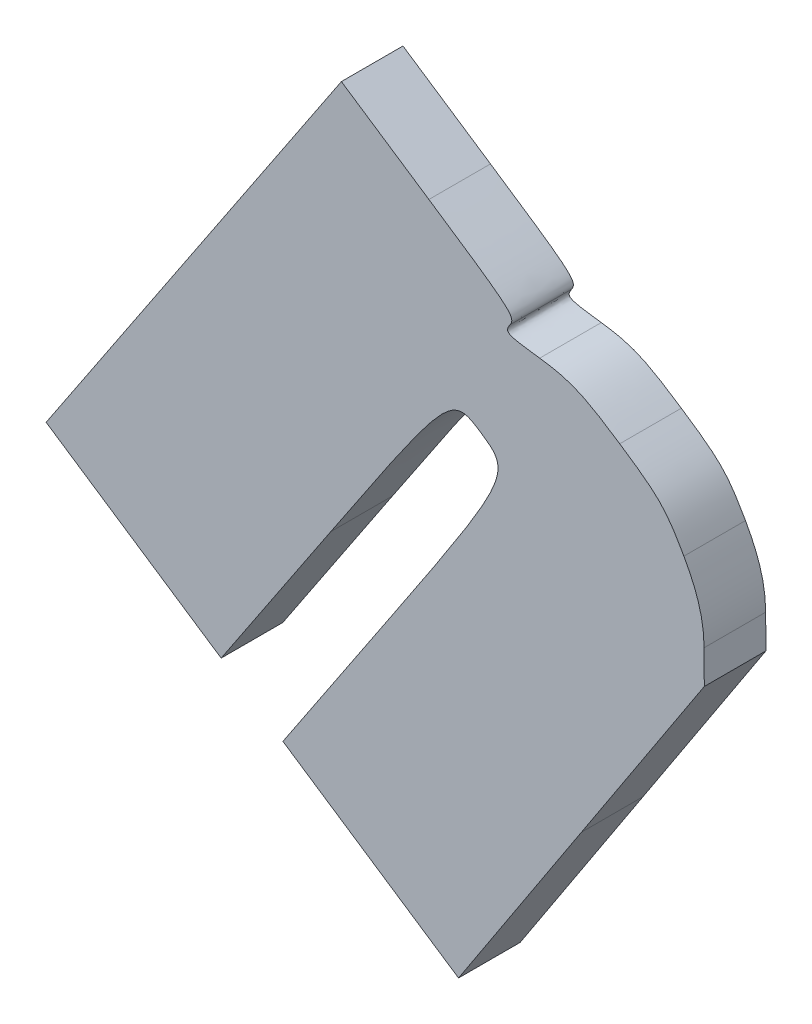
ISO-10303-21;
HEADER;
FILE_DESCRIPTION(('STEP AP214'),'2;1');
FILE_NAME('part.step','',(''),(''),'','','');
FILE_SCHEMA(('AUTOMOTIVE_DESIGN { 1 0 10303 214 1 1 1 1 }'));
ENDSEC;
DATA;
#1=APPLICATION_CONTEXT('core data for automotive mechanical design processes');
#2=APPLICATION_PROTOCOL_DEFINITION('international standard','automotive_design',2000,#1);
#3=PRODUCT_CONTEXT('',#1,'mechanical');
#4=PRODUCT('Part','Part','',(#3));
#5=PRODUCT_RELATED_PRODUCT_CATEGORY('part','',(#4));
#6=PRODUCT_DEFINITION_FORMATION('','',#4);
#7=PRODUCT_DEFINITION_CONTEXT('part definition',#1,'design');
#8=PRODUCT_DEFINITION('design','',#6,#7);
#9=PRODUCT_DEFINITION_SHAPE('','',#8);
#10=(LENGTH_UNIT() NAMED_UNIT(*) SI_UNIT(.MILLI.,.METRE.));
#11=(NAMED_UNIT(*) PLANE_ANGLE_UNIT() SI_UNIT($,.RADIAN.));
#12=(NAMED_UNIT(*) SI_UNIT($,.STERADIAN.) SOLID_ANGLE_UNIT());
#13=UNCERTAINTY_MEASURE_WITH_UNIT(LENGTH_MEASURE(1.E-05),#10,'distance_accuracy_value','');
#14=(GEOMETRIC_REPRESENTATION_CONTEXT(3) GLOBAL_UNCERTAINTY_ASSIGNED_CONTEXT((#13)) GLOBAL_UNIT_ASSIGNED_CONTEXT((#10,
#11,#12)) REPRESENTATION_CONTEXT('',''));
#15=CARTESIAN_POINT('',(0.,0.,0.));
#16=DIRECTION('',(0.,0.,1.));
#17=DIRECTION('',(1.,0.,0.));
#18=AXIS2_PLACEMENT_3D('',#15,#16,#17);
#19=CARTESIAN_POINT('',(-3.50758858771,-2.335805763627,0.));
#20=DIRECTION('',(0.836616693344232,-0.547788744332853,0.));
#21=DIRECTION('',(0.547788744332853,0.836616693344232,0.));
#22=AXIS2_PLACEMENT_3D('',#19,#20,#21);
#23=PLANE('',#22);
#24=DIRECTION('',(0.547788744332853,0.836616693344232,0.));
#25=VECTOR('',#24,1.);
#26=CARTESIAN_POINT('',(-3.50758858771,-2.335805763627,0.));
#27=LINE('',#26,#25);
#28=CARTESIAN_POINT('',(-3.50758858771,-2.335805763627,0.));
#29=VERTEX_POINT('',#28);
#30=CARTESIAN_POINT('',(-3.487638773381,-2.305337179032,0.));
#31=VERTEX_POINT('',#30);
#32=EDGE_CURVE('E11',#29,#31,#27,.T.);
#33=ORIENTED_EDGE('',*,*,#32,.T.);
#34=DIRECTION('',(0.,0.,1.));
#35=VECTOR('',#34,1.);
#36=CARTESIAN_POINT('',(-3.487638773381,-2.305337179032,0.));
#37=LINE('',#36,#35);
#38=CARTESIAN_POINT('',(-3.487638773381,-2.305337179032,0.01));
#39=VERTEX_POINT('',#38);
#40=EDGE_CURVE('E24',#31,#39,#37,.T.);
#41=ORIENTED_EDGE('',*,*,#40,.T.);
#42=DIRECTION('',(0.547788744332853,0.836616693344232,0.));
#43=VECTOR('',#42,1.);
#44=CARTESIAN_POINT('',(-3.50758858771,-2.335805763627,0.01));
#45=LINE('',#44,#43);
#46=CARTESIAN_POINT('',(-3.50758858771,-2.335805763627,0.01));
#47=VERTEX_POINT('',#46);
#48=EDGE_CURVE('E148',#47,#39,#45,.T.);
#49=ORIENTED_EDGE('',*,*,#48,.F.);
#50=DIRECTION('',(0.,0.,1.));
#51=VECTOR('',#50,1.);
#52=CARTESIAN_POINT('',(-3.50758858771,-2.335805763627,0.));
#53=LINE('',#52,#51);
#54=EDGE_CURVE('E336',#29,#47,#53,.T.);
#55=ORIENTED_EDGE('',*,*,#54,.F.);
#56=EDGE_LOOP('',(#33,#41,#49,#55));
#57=FACE_BOUND('',#56,.T.);
#58=ADVANCED_FACE('F17',(#57),#23,.T.);
#59=CARTESIAN_POINT('',(-3.536100829065,-2.316789946744,0.));
#60=DIRECTION('',(-0.554854841755568,-0.831947176556543,0.));
#61=DIRECTION('',(0.831947176556543,-0.554854841755568,0.));
#62=AXIS2_PLACEMENT_3D('',#59,#60,#61);
#63=PLANE('',#62);
#64=DIRECTION('',(0.831947176556543,-0.554854841755568,0.));
#65=VECTOR('',#64,1.);
#66=CARTESIAN_POINT('',(-3.536100829065,-2.316789946744,0.));
#67=LINE('',#66,#65);
#68=CARTESIAN_POINT('',(-3.536100829065,-2.316789946744,0.));
#69=VERTEX_POINT('',#68);
#70=EDGE_CURVE('E333',#69,#29,#67,.T.);
#71=ORIENTED_EDGE('',*,*,#70,.T.);
#72=ORIENTED_EDGE('',*,*,#54,.T.);
#73=DIRECTION('',(0.831947176556543,-0.554854841755568,0.));
#74=VECTOR('',#73,1.);
#75=CARTESIAN_POINT('',(-3.536100829065,-2.316789946744,0.01));
#76=LINE('',#75,#74);
#77=CARTESIAN_POINT('',(-3.536100829065,-2.316789946744,0.01));
#78=VERTEX_POINT('',#77);
#79=EDGE_CURVE('E331',#78,#47,#76,.T.);
#80=ORIENTED_EDGE('',*,*,#79,.F.);
#81=DIRECTION('',(0.,0.,1.));
#82=VECTOR('',#81,1.);
#83=CARTESIAN_POINT('',(-3.536100829065,-2.316789946744,0.));
#84=LINE('',#83,#82);
#85=EDGE_CURVE('E328',#69,#78,#84,.T.);
#86=ORIENTED_EDGE('',*,*,#85,.F.);
#87=EDGE_LOOP('',(#71,#72,#80,#86));
#88=FACE_BOUND('',#87,.T.);
#89=ADVANCED_FACE('F377',(#88),#63,.T.);
#90=CARTESIAN_POINT('',(-3.518666173916,-2.290648493099,0.));
#91=DIRECTION('',(-0.831947176556505,0.554854841755625,0.));
#92=DIRECTION('',(-0.554854841755625,-0.831947176556505,0.));
#93=AXIS2_PLACEMENT_3D('',#90,#91,#92);
#94=PLANE('',#93);
#95=DIRECTION('',(-0.554854841755625,-0.831947176556505,0.));
#96=VECTOR('',#95,1.);
#97=CARTESIAN_POINT('',(-3.518666173916,-2.290648493099,0.));
#98=LINE('',#97,#96);
#99=CARTESIAN_POINT('',(-3.518666173916,-2.290648493099,0.));
#100=VERTEX_POINT('',#99);
#101=EDGE_CURVE('E325',#100,#69,#98,.T.);
#102=ORIENTED_EDGE('',*,*,#101,.T.);
#103=ORIENTED_EDGE('',*,*,#85,.T.);
#104=DIRECTION('',(-0.554854841755625,-0.831947176556505,0.));
#105=VECTOR('',#104,1.);
#106=CARTESIAN_POINT('',(-3.518666173916,-2.290648493099,0.01));
#107=LINE('',#106,#105);
#108=CARTESIAN_POINT('',(-3.518666173916,-2.290648493099,0.01));
#109=VERTEX_POINT('',#108);
#110=EDGE_CURVE('E322',#109,#78,#107,.T.);
#111=ORIENTED_EDGE('',*,*,#110,.F.);
#112=DIRECTION('',(0.,0.,1.));
#113=VECTOR('',#112,1.);
#114=CARTESIAN_POINT('',(-3.518666173916,-2.290648493099,0.));
#115=LINE('',#114,#113);
#116=EDGE_CURVE('E316',#100,#109,#115,.T.);
#117=ORIENTED_EDGE('',*,*,#116,.F.);
#118=EDGE_LOOP('',(#102,#103,#111,#117));
#119=FACE_BOUND('',#118,.T.);
#120=ADVANCED_FACE('F374',(#119),#94,.T.);
#121=CARTESIAN_POINT('',(-3.503756256811,-2.25745560825,0.));
#122=CARTESIAN_POINT('',(-3.503756256811,-2.25745560825,0.01));
#123=CARTESIAN_POINT('',(-3.503335475025,-2.257736242427,0.));
#124=CARTESIAN_POINT('',(-3.503335475025,-2.257736242427,0.01));
#125=CARTESIAN_POINT('',(-3.502947198134,-2.258005439602,0.));
#126=CARTESIAN_POINT('',(-3.502947198134,-2.258005439602,0.01));
#127=CARTESIAN_POINT('',(-3.502240810753,-2.258578634989,0.));
#128=CARTESIAN_POINT('',(-3.502240810753,-2.258578634989,0.01));
#129=CARTESIAN_POINT('',(-3.501930140187,-2.258884315209,0.));
#130=CARTESIAN_POINT('',(-3.501930140187,-2.258884315209,0.01));
#131=CARTESIAN_POINT('',(-3.501487274858,-2.259524719963,0.));
#132=CARTESIAN_POINT('',(-3.501487274858,-2.259524719963,0.01));
#133=CARTESIAN_POINT('',(-3.501343450514,-2.25984187623,0.));
#134=CARTESIAN_POINT('',(-3.501343450514,-2.25984187623,0.01));
#135=CARTESIAN_POINT('',(-3.501168630304,-2.260602561726,0.));
#136=CARTESIAN_POINT('',(-3.501168630304,-2.260602561726,0.01));
#137=CARTESIAN_POINT('',(-3.501156723355,-2.261066779484,0.));
#138=CARTESIAN_POINT('',(-3.501156723355,-2.261066779484,0.01));
#139=CARTESIAN_POINT('',(-3.501373242916,-2.262471535714,0.));
#140=CARTESIAN_POINT('',(-3.501373242916,-2.262471535714,0.01));
#141=CARTESIAN_POINT('',(-3.501721930447,-2.26343181761,0.));
#142=CARTESIAN_POINT('',(-3.501721930447,-2.26343181761,0.01));
#143=CARTESIAN_POINT('',(-3.504093078297,-2.268710549124,0.));
#144=CARTESIAN_POINT('',(-3.504093078297,-2.268710549124,0.01));
#145=CARTESIAN_POINT('',(-3.50902412447,-2.276191241924,0.));
#146=CARTESIAN_POINT('',(-3.50902412447,-2.276191241924,0.01));
#147=CARTESIAN_POINT('',(-3.518666173916,-2.290648493099,0.));
#148=CARTESIAN_POINT('',(-3.518666173916,-2.290648493099,0.01));
#149=B_SPLINE_SURFACE_WITH_KNOTS('',3,1,((#121,#122),(#123,#124),(#125,#126),(#127,#128),(#129,
#130),(#131,#132),(#133,#134),(#135,#136),(#137,#138),(#139,#140),(#141,#142),(#143,#144),(#145,
#146),(#147,#148)),.UNSPECIFIED.,.F.,.F.,.F.,(4,2,2,2,2,2,4),(2,2),(0.,0.001431791294951,
0.002982479137338,0.004332679898994,0.005893946951502,0.008317110785515,0.018743675054939),(0.,
0.001),.UNSPECIFIED.);
#150=CARTESIAN_POINT('',(-3.503756256811,-2.25745560825,0.));
#151=CARTESIAN_POINT('',(-3.503335475025,-2.257736242427,0.));
#152=CARTESIAN_POINT('',(-3.502947198134,-2.258005439602,0.));
#153=CARTESIAN_POINT('',(-3.502240810753,-2.258578634989,0.));
#154=CARTESIAN_POINT('',(-3.501930140187,-2.258884315209,0.));
#155=CARTESIAN_POINT('',(-3.501487274858,-2.259524719963,0.));
#156=CARTESIAN_POINT('',(-3.501343450514,-2.25984187623,0.));
#157=CARTESIAN_POINT('',(-3.501168630304,-2.260602561726,0.));
#158=CARTESIAN_POINT('',(-3.501156723355,-2.261066779484,0.));
#159=CARTESIAN_POINT('',(-3.501373242916,-2.262471535714,0.));
#160=CARTESIAN_POINT('',(-3.501721930447,-2.26343181761,0.));
#161=CARTESIAN_POINT('',(-3.504093078297,-2.268710549124,0.));
#162=CARTESIAN_POINT('',(-3.50902412447,-2.276191241924,0.));
#163=CARTESIAN_POINT('',(-3.518666173916,-2.290648493099,0.));
#164=B_SPLINE_CURVE_WITH_KNOTS('',3,(#150,#151,#152,#153,#154,#155,#156,#157,#158,#159,#160,
#161,#162,#163),.UNSPECIFIED.,.F.,.F.,(4,2,2,2,2,2,4),(0.,0.001431791294951,0.002982479137338,
0.004332679898994,0.005893946951502,0.008317110785515,0.018743675054939),.UNSPECIFIED.);
#165=CARTESIAN_POINT('',(-3.503756256811,-2.25745560825,0.));
#166=VERTEX_POINT('',#165);
#167=EDGE_CURVE('E308',#166,#100,#164,.T.);
#168=CARTESIAN_POINT('',(-3.503756256811,-2.25745560825,0.01));
#169=CARTESIAN_POINT('',(-3.503335475025,-2.257736242427,0.01));
#170=CARTESIAN_POINT('',(-3.502947198134,-2.258005439602,0.01));
#171=CARTESIAN_POINT('',(-3.502240810753,-2.258578634989,0.01));
#172=CARTESIAN_POINT('',(-3.501930140187,-2.258884315209,0.01));
#173=CARTESIAN_POINT('',(-3.501487274858,-2.259524719963,0.01));
#174=CARTESIAN_POINT('',(-3.501343450514,-2.25984187623,0.01));
#175=CARTESIAN_POINT('',(-3.501168630304,-2.260602561726,0.01));
#176=CARTESIAN_POINT('',(-3.501156723355,-2.261066779484,0.01));
#177=CARTESIAN_POINT('',(-3.501373242916,-2.262471535714,0.01));
#178=CARTESIAN_POINT('',(-3.501721930447,-2.26343181761,0.01));
#179=CARTESIAN_POINT('',(-3.504093078297,-2.268710549124,0.01));
#180=CARTESIAN_POINT('',(-3.50902412447,-2.276191241924,0.01));
#181=CARTESIAN_POINT('',(-3.518666173916,-2.290648493099,0.01));
#182=B_SPLINE_CURVE_WITH_KNOTS('',3,(#168,#169,#170,#171,#172,#173,#174,#175,#176,#177,#178,
#179,#180,#181),.UNSPECIFIED.,.F.,.F.,(4,2,2,2,2,2,4),(0.,0.001431791294951,0.002982479137338,
0.004332679898994,0.005893946951502,0.008317110785515,0.018743675054939),.UNSPECIFIED.);
#183=CARTESIAN_POINT('',(-3.503756256811,-2.25745560825,0.01));
#184=VERTEX_POINT('',#183);
#185=EDGE_CURVE('E303',#184,#109,#182,.T.);
#186=DIRECTION('',(0.,0.,1.));
#187=VECTOR('',#186,1.);
#188=CARTESIAN_POINT('',(-3.503756256811,-2.25745560825,0.));
#189=LINE('',#188,#187);
#190=EDGE_CURVE('E297',#166,#184,#189,.T.);
#191=ORIENTED_EDGE('',*,*,#167,.T.);
#192=ORIENTED_EDGE('',*,*,#116,.T.);
#193=ORIENTED_EDGE('',*,*,#185,.F.);
#194=ORIENTED_EDGE('',*,*,#190,.F.);
#195=EDGE_LOOP('',(#191,#192,#193,#194));
#196=FACE_BOUND('',#195,.T.);
#197=ADVANCED_FACE('F371',(#196),#149,.T.);
#198=CARTESIAN_POINT('',(-3.528332748041,-2.283415302997,0.));
#199=CARTESIAN_POINT('',(-3.528332748041,-2.283415302997,0.01));
#200=CARTESIAN_POINT('',(-3.520835191726,-2.272173497007,0.));
#201=CARTESIAN_POINT('',(-3.520835191726,-2.272173497007,0.01));
#202=CARTESIAN_POINT('',(-3.516219568748,-2.265252891133,0.));
#203=CARTESIAN_POINT('',(-3.516219568748,-2.265252891133,0.01));
#204=CARTESIAN_POINT('',(-3.511610179836,-2.259243616746,0.));
#205=CARTESIAN_POINT('',(-3.511610179836,-2.259243616746,0.01));
#206=CARTESIAN_POINT('',(-3.510466287118,-2.257951945536,0.));
#207=CARTESIAN_POINT('',(-3.510466287118,-2.257951945536,0.01));
#208=CARTESIAN_POINT('',(-3.508993026628,-2.256702739628,0.));
#209=CARTESIAN_POINT('',(-3.508993026628,-2.256702739628,0.01));
#210=CARTESIAN_POINT('',(-3.508535412227,-2.256405267388,0.));
#211=CARTESIAN_POINT('',(-3.508535412227,-2.256405267388,0.01));
#212=CARTESIAN_POINT('',(-3.507756519619,-2.256067215621,0.));
#213=CARTESIAN_POINT('',(-3.507756519619,-2.256067215621,0.01));
#214=CARTESIAN_POINT('',(-3.507425973,-2.255990817727,0.));
#215=CARTESIAN_POINT('',(-3.507425973,-2.255990817727,0.01));
#216=CARTESIAN_POINT('',(-3.506733747328,-2.255961949918,0.));
#217=CARTESIAN_POINT('',(-3.506733747328,-2.255961949918,0.01));
#218=CARTESIAN_POINT('',(-3.506380235875,-2.2560307403,0.));
#219=CARTESIAN_POINT('',(-3.506380235875,-2.2560307403,0.01));
#220=CARTESIAN_POINT('',(-3.505338388617,-2.256400458887,0.));
#221=CARTESIAN_POINT('',(-3.505338388617,-2.256400458887,0.01));
#222=CARTESIAN_POINT('',(-3.504622239943,-2.256878053651,0.));
#223=CARTESIAN_POINT('',(-3.504622239943,-2.256878053651,0.01));
#224=CARTESIAN_POINT('',(-3.503756256811,-2.25745560825,0.));
#225=CARTESIAN_POINT('',(-3.503756256811,-2.25745560825,0.01));
#226=B_SPLINE_SURFACE_WITH_KNOTS('',3,1,((#198,#199),(#200,#201),(#202,#203),(#204,#205),(#206,
#207),(#208,#209),(#210,#211),(#212,#213),(#214,#215),(#216,#217),(#218,#219),(#220,#221),(#222,
#223),(#224,#225)),.UNSPECIFIED.,.F.,.F.,.F.,(4,2,2,2,2,2,4),(2,2),(0.,0.001327561020278,
0.001953185824936,0.002284201265773,0.002556855963974,0.002871255404629,0.003495802117152),(0.,
0.001),.UNSPECIFIED.);
#227=CARTESIAN_POINT('',(-3.528332748041,-2.283415302997,0.));
#228=CARTESIAN_POINT('',(-3.520835191726,-2.272173497007,0.));
#229=CARTESIAN_POINT('',(-3.516219568748,-2.265252891133,0.));
#230=CARTESIAN_POINT('',(-3.511610179836,-2.259243616746,0.));
#231=CARTESIAN_POINT('',(-3.510466287118,-2.257951945536,0.));
#232=CARTESIAN_POINT('',(-3.508993026628,-2.256702739628,0.));
#233=CARTESIAN_POINT('',(-3.508535412227,-2.256405267388,0.));
#234=CARTESIAN_POINT('',(-3.507756519619,-2.256067215621,0.));
#235=CARTESIAN_POINT('',(-3.507425973,-2.255990817727,0.));
#236=CARTESIAN_POINT('',(-3.506733747328,-2.255961949918,0.));
#237=CARTESIAN_POINT('',(-3.506380235875,-2.2560307403,0.));
#238=CARTESIAN_POINT('',(-3.505338388617,-2.256400458887,0.));
#239=CARTESIAN_POINT('',(-3.504622239943,-2.256878053651,0.));
#240=CARTESIAN_POINT('',(-3.503756256811,-2.25745560825,0.));
#241=B_SPLINE_CURVE_WITH_KNOTS('',3,(#227,#228,#229,#230,#231,#232,#233,#234,#235,#236,#237,
#238,#239,#240),.UNSPECIFIED.,.F.,.F.,(4,2,2,2,2,2,4),(0.,0.001327561020278,0.001953185824936,
0.002284201265773,0.002556855963974,0.002871255404629,0.003495802117152),.UNSPECIFIED.);
#242=CARTESIAN_POINT('',(-3.528332748041,-2.283415302997,0.));
#243=VERTEX_POINT('',#242);
#244=EDGE_CURVE('E289',#243,#166,#241,.T.);
#245=CARTESIAN_POINT('',(-3.528332748041,-2.283415302997,0.01));
#246=CARTESIAN_POINT('',(-3.520835191726,-2.272173497007,0.01));
#247=CARTESIAN_POINT('',(-3.516219568748,-2.265252891133,0.01));
#248=CARTESIAN_POINT('',(-3.511610179836,-2.259243616746,0.01));
#249=CARTESIAN_POINT('',(-3.510466287118,-2.257951945536,0.01));
#250=CARTESIAN_POINT('',(-3.508993026628,-2.256702739628,0.01));
#251=CARTESIAN_POINT('',(-3.508535412227,-2.256405267388,0.01));
#252=CARTESIAN_POINT('',(-3.507756519619,-2.256067215621,0.01));
#253=CARTESIAN_POINT('',(-3.507425973,-2.255990817727,0.01));
#254=CARTESIAN_POINT('',(-3.506733747328,-2.255961949918,0.01));
#255=CARTESIAN_POINT('',(-3.506380235875,-2.2560307403,0.01));
#256=CARTESIAN_POINT('',(-3.505338388617,-2.256400458887,0.01));
#257=CARTESIAN_POINT('',(-3.504622239943,-2.256878053651,0.01));
#258=CARTESIAN_POINT('',(-3.503756256811,-2.25745560825,0.01));
#259=B_SPLINE_CURVE_WITH_KNOTS('',3,(#245,#246,#247,#248,#249,#250,#251,#252,#253,#254,#255,
#256,#257,#258),.UNSPECIFIED.,.F.,.F.,(4,2,2,2,2,2,4),(0.,0.001327561020278,0.001953185824936,
0.002284201265773,0.002556855963974,0.002871255404629,0.003495802117152),.UNSPECIFIED.);
#260=CARTESIAN_POINT('',(-3.528332748041,-2.283415302997,0.01));
#261=VERTEX_POINT('',#260);
#262=EDGE_CURVE('E284',#261,#184,#259,.T.);
#263=DIRECTION('',(0.,0.,1.));
#264=VECTOR('',#263,1.);
#265=CARTESIAN_POINT('',(-3.528332748041,-2.283415302997,0.));
#266=LINE('',#265,#264);
#267=EDGE_CURVE('E281',#243,#261,#266,.T.);
#268=ORIENTED_EDGE('',*,*,#244,.T.);
#269=ORIENTED_EDGE('',*,*,#190,.T.);
#270=ORIENTED_EDGE('',*,*,#262,.F.);
#271=ORIENTED_EDGE('',*,*,#267,.F.);
#272=EDGE_LOOP('',(#268,#269,#270,#271));
#273=FACE_BOUND('',#272,.T.);
#274=ADVANCED_FACE('F368',(#273),#226,.T.);
#275=CARTESIAN_POINT('',(-3.546130326322,-2.310100922164,0.));
#276=DIRECTION('',(0.831947176556568,-0.554854841755531,0.));
#277=DIRECTION('',(0.554854841755531,0.831947176556568,0.));
#278=AXIS2_PLACEMENT_3D('',#275,#276,#277);
#279=PLANE('',#278);
#280=DIRECTION('',(0.554854841755531,0.831947176556568,0.));
#281=VECTOR('',#280,1.);
#282=CARTESIAN_POINT('',(-3.546130326322,-2.310100922164,0.));
#283=LINE('',#282,#281);
#284=CARTESIAN_POINT('',(-3.546130326322,-2.310100922164,0.));
#285=VERTEX_POINT('',#284);
#286=EDGE_CURVE('E278',#285,#243,#283,.T.);
#287=ORIENTED_EDGE('',*,*,#286,.T.);
#288=ORIENTED_EDGE('',*,*,#267,.T.);
#289=DIRECTION('',(0.554854841755531,0.831947176556568,0.));
#290=VECTOR('',#289,1.);
#291=CARTESIAN_POINT('',(-3.546130326322,-2.310100922164,0.01));
#292=LINE('',#291,#290);
#293=CARTESIAN_POINT('',(-3.546130326322,-2.310100922164,0.01));
#294=VERTEX_POINT('',#293);
#295=EDGE_CURVE('E275',#294,#261,#292,.T.);
#296=ORIENTED_EDGE('',*,*,#295,.F.);
#297=DIRECTION('',(0.,0.,1.));
#298=VECTOR('',#297,1.);
#299=CARTESIAN_POINT('',(-3.546130326322,-2.310100922164,0.));
#300=LINE('',#299,#298);
#301=EDGE_CURVE('E272',#285,#294,#300,.T.);
#302=ORIENTED_EDGE('',*,*,#301,.F.);
#303=EDGE_LOOP('',(#287,#288,#296,#302));
#304=FACE_BOUND('',#303,.T.);
#305=ADVANCED_FACE('F365',(#304),#279,.T.);
#306=CARTESIAN_POINT('',(-3.574547274394,-2.291148659725,0.));
#307=DIRECTION('',(-0.554854841755583,-0.831947176556533,0.));
#308=DIRECTION('',(0.831947176556533,-0.554854841755583,0.));
#309=AXIS2_PLACEMENT_3D('',#306,#307,#308);
#310=PLANE('',#309);
#311=DIRECTION('',(0.831947176556533,-0.554854841755583,0.));
#312=VECTOR('',#311,1.);
#313=CARTESIAN_POINT('',(-3.574547274394,-2.291148659725,0.));
#314=LINE('',#313,#312);
#315=CARTESIAN_POINT('',(-3.574547274394,-2.291148659725,0.));
#316=VERTEX_POINT('',#315);
#317=EDGE_CURVE('E269',#316,#285,#314,.T.);
#318=ORIENTED_EDGE('',*,*,#317,.T.);
#319=ORIENTED_EDGE('',*,*,#301,.T.);
#320=DIRECTION('',(0.831947176556533,-0.554854841755583,0.));
#321=VECTOR('',#320,1.);
#322=CARTESIAN_POINT('',(-3.574547274394,-2.291148659725,0.01));
#323=LINE('',#322,#321);
#324=CARTESIAN_POINT('',(-3.574547274394,-2.291148659725,0.01));
#325=VERTEX_POINT('',#324);
#326=EDGE_CURVE('E266',#325,#294,#323,.T.);
#327=ORIENTED_EDGE('',*,*,#326,.F.);
#328=DIRECTION('',(0.,0.,1.));
#329=VECTOR('',#328,1.);
#330=CARTESIAN_POINT('',(-3.574547274394,-2.291148659725,0.));
#331=LINE('',#330,#329);
#332=EDGE_CURVE('E263',#316,#325,#331,.T.);
#333=ORIENTED_EDGE('',*,*,#332,.F.);
#334=EDGE_LOOP('',(#318,#319,#327,#333));
#335=FACE_BOUND('',#334,.T.);
#336=ADVANCED_FACE('F362',(#335),#310,.T.);
#337=CARTESIAN_POINT('',(-3.526609273613,-2.21927060911,0.));
#338=DIRECTION('',(-0.831947176556533,0.554854841755583,0.));
#339=DIRECTION('',(-0.554854841755583,-0.831947176556533,0.));
#340=AXIS2_PLACEMENT_3D('',#337,#338,#339);
#341=PLANE('',#340);
#342=DIRECTION('',(-0.554854841755583,-0.831947176556533,0.));
#343=VECTOR('',#342,1.);
#344=CARTESIAN_POINT('',(-3.526609273613,-2.21927060911,0.));
#345=LINE('',#344,#343);
#346=CARTESIAN_POINT('',(-3.526609273613,-2.21927060911,0.));
#347=VERTEX_POINT('',#346);
#348=EDGE_CURVE('E260',#347,#316,#345,.T.);
#349=ORIENTED_EDGE('',*,*,#348,.T.);
#350=ORIENTED_EDGE('',*,*,#332,.T.);
#351=DIRECTION('',(-0.554854841755583,-0.831947176556533,0.));
#352=VECTOR('',#351,1.);
#353=CARTESIAN_POINT('',(-3.526609273613,-2.21927060911,0.01));
#354=LINE('',#353,#352);
#355=CARTESIAN_POINT('',(-3.526609273613,-2.21927060911,0.01));
#356=VERTEX_POINT('',#355);
#357=EDGE_CURVE('E257',#356,#325,#354,.T.);
#358=ORIENTED_EDGE('',*,*,#357,.F.);
#359=DIRECTION('',(0.,0.,1.));
#360=VECTOR('',#359,1.);
#361=CARTESIAN_POINT('',(-3.526609273613,-2.21927060911,0.));
#362=LINE('',#361,#360);
#363=EDGE_CURVE('E254',#347,#356,#362,.T.);
#364=ORIENTED_EDGE('',*,*,#363,.F.);
#365=EDGE_LOOP('',(#349,#350,#358,#364));
#366=FACE_BOUND('',#365,.T.);
#367=ADVANCED_FACE('F359',(#366),#341,.T.);
#368=CARTESIAN_POINT('',(-3.512400779988,-2.228746753394,0.));
#369=DIRECTION('',(0.55485484175555,0.831947176556555,0.));
#370=DIRECTION('',(-0.831947176556555,0.55485484175555,0.));
#371=AXIS2_PLACEMENT_3D('',#368,#369,#370);
#372=PLANE('',#371);
#373=DIRECTION('',(-0.831947176556555,0.55485484175555,0.));
#374=VECTOR('',#373,1.);
#375=CARTESIAN_POINT('',(-3.512400779988,-2.228746753394,0.));
#376=LINE('',#375,#374);
#377=CARTESIAN_POINT('',(-3.512400779988,-2.228746753394,0.));
#378=VERTEX_POINT('',#377);
#379=EDGE_CURVE('E251',#378,#347,#376,.T.);
#380=ORIENTED_EDGE('',*,*,#379,.T.);
#381=ORIENTED_EDGE('',*,*,#363,.T.);
#382=DIRECTION('',(-0.831947176556555,0.55485484175555,0.));
#383=VECTOR('',#382,1.);
#384=CARTESIAN_POINT('',(-3.512400779988,-2.228746753394,0.01));
#385=LINE('',#384,#383);
#386=CARTESIAN_POINT('',(-3.512400779988,-2.228746753394,0.01));
#387=VERTEX_POINT('',#386);
#388=EDGE_CURVE('E248',#387,#356,#385,.T.);
#389=ORIENTED_EDGE('',*,*,#388,.F.);
#390=DIRECTION('',(0.,0.,1.));
#391=VECTOR('',#390,1.);
#392=CARTESIAN_POINT('',(-3.512400779988,-2.228746753394,0.));
#393=LINE('',#392,#391);
#394=EDGE_CURVE('E242',#378,#387,#393,.T.);
#395=ORIENTED_EDGE('',*,*,#394,.F.);
#396=EDGE_LOOP('',(#380,#381,#389,#395));
#397=FACE_BOUND('',#396,.T.);
#398=ADVANCED_FACE('F356',(#397),#372,.T.);
#399=CARTESIAN_POINT('',(-3.499221921456,-2.239766643632,0.));
#400=CARTESIAN_POINT('',(-3.499221921456,-2.239766643632,0.01));
#401=CARTESIAN_POINT('',(-3.499094307893,-2.239575300356,0.));
#402=CARTESIAN_POINT('',(-3.499094307893,-2.239575300356,0.01));
#403=CARTESIAN_POINT('',(-3.498999201521,-2.23939642834,0.));
#404=CARTESIAN_POINT('',(-3.498999201521,-2.23939642834,0.01));
#405=CARTESIAN_POINT('',(-3.498936993514,-2.239089849136,0.));
#406=CARTESIAN_POINT('',(-3.498936993514,-2.239089849136,0.01));
#407=CARTESIAN_POINT('',(-3.498937295219,-2.238972708189,0.));
#408=CARTESIAN_POINT('',(-3.498937295219,-2.238972708189,0.01));
#409=CARTESIAN_POINT('',(-3.49898984641,-2.238709214736,0.));
#410=CARTESIAN_POINT('',(-3.49898984641,-2.238709214736,0.01));
#411=CARTESIAN_POINT('',(-3.4990544401,-2.238554689373,0.));
#412=CARTESIAN_POINT('',(-3.4990544401,-2.238554689373,0.01));
#413=CARTESIAN_POINT('',(-3.499387486669,-2.238028964796,0.));
#414=CARTESIAN_POINT('',(-3.499387486669,-2.238028964796,0.01));
#415=CARTESIAN_POINT('',(-3.499799012879,-2.237601080247,0.));
#416=CARTESIAN_POINT('',(-3.499799012879,-2.237601080247,0.01));
#417=CARTESIAN_POINT('',(-3.502236477352,-2.23556291518,0.));
#418=CARTESIAN_POINT('',(-3.502236477352,-2.23556291518,0.01));
#419=CARTESIAN_POINT('',(-3.505769344318,-2.233169491151,0.));
#420=CARTESIAN_POINT('',(-3.505769344318,-2.233169491151,0.01));
#421=CARTESIAN_POINT('',(-3.512400779988,-2.228746753394,0.));
#422=CARTESIAN_POINT('',(-3.512400779988,-2.228746753394,0.01));
#423=B_SPLINE_SURFACE_WITH_KNOTS('',3,1,((#399,#400),(#401,#402),(#403,#404),(#405,#406),(#407,
#408),(#409,#410),(#411,#412),(#413,#414),(#415,#416),(#417,#418),(#419,#420),(#421,#422)),
.UNSPECIFIED.,.F.,.F.,.F.,(4,2,2,2,2,4),(2,2),(0.,0.001163898231741,0.001907029225579,
0.002806402098321,0.004656320131731,0.009438909116129),(0.,0.001),.UNSPECIFIED.);
#424=CARTESIAN_POINT('',(-3.499221921456,-2.239766643632,0.));
#425=CARTESIAN_POINT('',(-3.499094307893,-2.239575300356,0.));
#426=CARTESIAN_POINT('',(-3.498999201521,-2.23939642834,0.));
#427=CARTESIAN_POINT('',(-3.498936993514,-2.239089849136,0.));
#428=CARTESIAN_POINT('',(-3.498937295219,-2.238972708189,0.));
#429=CARTESIAN_POINT('',(-3.49898984641,-2.238709214736,0.));
#430=CARTESIAN_POINT('',(-3.4990544401,-2.238554689373,0.));
#431=CARTESIAN_POINT('',(-3.499387486669,-2.238028964796,0.));
#432=CARTESIAN_POINT('',(-3.499799012879,-2.237601080247,0.));
#433=CARTESIAN_POINT('',(-3.502236477352,-2.23556291518,0.));
#434=CARTESIAN_POINT('',(-3.505769344318,-2.233169491151,0.));
#435=CARTESIAN_POINT('',(-3.512400779988,-2.228746753394,0.));
#436=B_SPLINE_CURVE_WITH_KNOTS('',3,(#424,#425,#426,#427,#428,#429,#430,#431,#432,#433,#434,
#435),.UNSPECIFIED.,.F.,.F.,(4,2,2,2,2,4),(0.,0.001163898231741,0.001907029225579,
0.002806402098321,0.004656320131731,0.009438909116129),.UNSPECIFIED.);
#437=CARTESIAN_POINT('',(-3.499221921456,-2.239766643632,0.));
#438=VERTEX_POINT('',#437);
#439=EDGE_CURVE('E234',#438,#378,#436,.T.);
#440=CARTESIAN_POINT('',(-3.499221921456,-2.239766643632,0.01));
#441=CARTESIAN_POINT('',(-3.499094307893,-2.239575300356,0.01));
#442=CARTESIAN_POINT('',(-3.498999201521,-2.23939642834,0.01));
#443=CARTESIAN_POINT('',(-3.498936993514,-2.239089849136,0.01));
#444=CARTESIAN_POINT('',(-3.498937295219,-2.238972708189,0.01));
#445=CARTESIAN_POINT('',(-3.49898984641,-2.238709214736,0.01));
#446=CARTESIAN_POINT('',(-3.4990544401,-2.238554689373,0.01));
#447=CARTESIAN_POINT('',(-3.499387486669,-2.238028964796,0.01));
#448=CARTESIAN_POINT('',(-3.499799012879,-2.237601080247,0.01));
#449=CARTESIAN_POINT('',(-3.502236477352,-2.23556291518,0.01));
#450=CARTESIAN_POINT('',(-3.505769344318,-2.233169491151,0.01));
#451=CARTESIAN_POINT('',(-3.512400779988,-2.228746753394,0.01));
#452=B_SPLINE_CURVE_WITH_KNOTS('',3,(#440,#441,#442,#443,#444,#445,#446,#447,#448,#449,#450,
#451),.UNSPECIFIED.,.F.,.F.,(4,2,2,2,2,4),(0.,0.001163898231741,0.001907029225579,
0.002806402098321,0.004656320131731,0.009438909116129),.UNSPECIFIED.);
#453=CARTESIAN_POINT('',(-3.499221921456,-2.239766643632,0.01));
#454=VERTEX_POINT('',#453);
#455=EDGE_CURVE('E229',#454,#387,#452,.T.);
#456=DIRECTION('',(0.,0.,1.));
#457=VECTOR('',#456,1.);
#458=CARTESIAN_POINT('',(-3.499221921456,-2.239766643632,0.));
#459=LINE('',#458,#457);
#460=EDGE_CURVE('E223',#438,#454,#459,.T.);
#461=ORIENTED_EDGE('',*,*,#439,.T.);
#462=ORIENTED_EDGE('',*,*,#394,.T.);
#463=ORIENTED_EDGE('',*,*,#455,.F.);
#464=ORIENTED_EDGE('',*,*,#460,.F.);
#465=EDGE_LOOP('',(#461,#462,#463,#464));
#466=FACE_BOUND('',#465,.T.);
#467=ADVANCED_FACE('F353',(#466),#423,.T.);
#468=CARTESIAN_POINT('',(-3.49441595237,-2.242066248307,0.));
#469=CARTESIAN_POINT('',(-3.49441595237,-2.242066248307,0.01));
#470=CARTESIAN_POINT('',(-3.496363892367,-2.241813935276,0.));
#471=CARTESIAN_POINT('',(-3.496363892367,-2.241813935276,0.01));
#472=CARTESIAN_POINT('',(-3.497655481627,-2.241629223991,0.));
#473=CARTESIAN_POINT('',(-3.497655481627,-2.241629223991,0.01));
#474=CARTESIAN_POINT('',(-3.498751350504,-2.241357715902,0.));
#475=CARTESIAN_POINT('',(-3.498751350504,-2.241357715902,0.01));
#476=CARTESIAN_POINT('',(-3.499029269374,-2.241272565841,0.));
#477=CARTESIAN_POINT('',(-3.499029269374,-2.241272565841,0.01));
#478=CARTESIAN_POINT('',(-3.49933283222,-2.241115332118,0.));
#479=CARTESIAN_POINT('',(-3.49933283222,-2.241115332118,0.01));
#480=CARTESIAN_POINT('',(-3.499415551892,-2.241060426691,0.));
#481=CARTESIAN_POINT('',(-3.499415551892,-2.241060426691,0.01));
#482=CARTESIAN_POINT('',(-3.499523277275,-2.240954717652,0.));
#483=CARTESIAN_POINT('',(-3.499523277275,-2.240954717652,0.01));
#484=CARTESIAN_POINT('',(-3.499560017052,-2.240906863296,0.));
#485=CARTESIAN_POINT('',(-3.499560017052,-2.240906863296,0.01));
#486=CARTESIAN_POINT('',(-3.499611153454,-2.240798917109,0.));
#487=CARTESIAN_POINT('',(-3.499611153454,-2.240798917109,0.01));
#488=CARTESIAN_POINT('',(-3.499624337892,-2.240743081877,0.));
#489=CARTESIAN_POINT('',(-3.499624337892,-2.240743081877,0.01));
#490=CARTESIAN_POINT('',(-3.499630641654,-2.240608841274,0.));
#491=CARTESIAN_POINT('',(-3.499630641654,-2.240608841274,0.01));
#492=CARTESIAN_POINT('',(-3.499617032597,-2.240529752849,0.));
#493=CARTESIAN_POINT('',(-3.499617032597,-2.240529752849,0.01));
#494=CARTESIAN_POINT('',(-3.499530707491,-2.240256074124,0.));
#495=CARTESIAN_POINT('',(-3.499530707491,-2.240256074124,0.01));
#496=CARTESIAN_POINT('',(-3.499399671048,-2.240033160674,0.));
#497=CARTESIAN_POINT('',(-3.499399671048,-2.240033160674,0.01));
#498=CARTESIAN_POINT('',(-3.499221921456,-2.239766643632,0.));
#499=CARTESIAN_POINT('',(-3.499221921456,-2.239766643632,0.01));
#500=B_SPLINE_SURFACE_WITH_KNOTS('',3,1,((#468,#469),(#470,#471),(#472,#473),(#474,#475),(#476,
#477),(#478,#479),(#480,#481),(#482,#483),(#484,#485),(#486,#487),(#488,#489),(#490,#491),(#492,
#493),(#494,#495),(#496,#497),(#498,#499)),.UNSPECIFIED.,.F.,.F.,.F.,(4,2,2,2,2,2,2,4),(2,2),
(0.,0.000623369202062524,0.000842928306332502,0.000942866742396204,0.001009681357132,
0.001074619271165,0.001157942073144,0.001350154066181),(0.,0.001),.UNSPECIFIED.);
#501=CARTESIAN_POINT('',(-3.49441595237,-2.242066248307,0.));
#502=CARTESIAN_POINT('',(-3.496363892367,-2.241813935276,0.));
#503=CARTESIAN_POINT('',(-3.497655481627,-2.241629223991,0.));
#504=CARTESIAN_POINT('',(-3.498751350504,-2.241357715902,0.));
#505=CARTESIAN_POINT('',(-3.499029269374,-2.241272565841,0.));
#506=CARTESIAN_POINT('',(-3.49933283222,-2.241115332118,0.));
#507=CARTESIAN_POINT('',(-3.499415551892,-2.241060426691,0.));
#508=CARTESIAN_POINT('',(-3.499523277275,-2.240954717652,0.));
#509=CARTESIAN_POINT('',(-3.499560017052,-2.240906863296,0.));
#510=CARTESIAN_POINT('',(-3.499611153454,-2.240798917109,0.));
#511=CARTESIAN_POINT('',(-3.499624337892,-2.240743081877,0.));
#512=CARTESIAN_POINT('',(-3.499630641654,-2.240608841274,0.));
#513=CARTESIAN_POINT('',(-3.499617032597,-2.240529752849,0.));
#514=CARTESIAN_POINT('',(-3.499530707491,-2.240256074124,0.));
#515=CARTESIAN_POINT('',(-3.499399671048,-2.240033160674,0.));
#516=CARTESIAN_POINT('',(-3.499221921456,-2.239766643632,0.));
#517=B_SPLINE_CURVE_WITH_KNOTS('',3,(#501,#502,#503,#504,#505,#506,#507,#508,#509,#510,#511,
#512,#513,#514,#515,#516),.UNSPECIFIED.,.F.,.F.,(4,2,2,2,2,2,2,4),(0.,0.000623369202062524,
0.000842928306332502,0.000942866742396204,0.001009681357132,0.001074619271165,0.001157942073144,
0.001350154066181),.UNSPECIFIED.);
#518=CARTESIAN_POINT('',(-3.49441595237,-2.242066248307,0.));
#519=VERTEX_POINT('',#518);
#520=EDGE_CURVE('E215',#519,#438,#517,.T.);
#521=CARTESIAN_POINT('',(-3.49441595237,-2.242066248307,0.01));
#522=CARTESIAN_POINT('',(-3.496363892367,-2.241813935276,0.01));
#523=CARTESIAN_POINT('',(-3.497655481627,-2.241629223991,0.01));
#524=CARTESIAN_POINT('',(-3.498751350504,-2.241357715902,0.01));
#525=CARTESIAN_POINT('',(-3.499029269374,-2.241272565841,0.01));
#526=CARTESIAN_POINT('',(-3.49933283222,-2.241115332118,0.01));
#527=CARTESIAN_POINT('',(-3.499415551892,-2.241060426691,0.01));
#528=CARTESIAN_POINT('',(-3.499523277275,-2.240954717652,0.01));
#529=CARTESIAN_POINT('',(-3.499560017052,-2.240906863296,0.01));
#530=CARTESIAN_POINT('',(-3.499611153454,-2.240798917109,0.01));
#531=CARTESIAN_POINT('',(-3.499624337892,-2.240743081877,0.01));
#532=CARTESIAN_POINT('',(-3.499630641654,-2.240608841274,0.01));
#533=CARTESIAN_POINT('',(-3.499617032597,-2.240529752849,0.01));
#534=CARTESIAN_POINT('',(-3.499530707491,-2.240256074124,0.01));
#535=CARTESIAN_POINT('',(-3.499399671048,-2.240033160674,0.01));
#536=CARTESIAN_POINT('',(-3.499221921456,-2.239766643632,0.01));
#537=B_SPLINE_CURVE_WITH_KNOTS('',3,(#521,#522,#523,#524,#525,#526,#527,#528,#529,#530,#531,
#532,#533,#534,#535,#536),.UNSPECIFIED.,.F.,.F.,(4,2,2,2,2,2,2,4),(0.,0.000623369202062524,
0.000842928306332502,0.000942866742396204,0.001009681357132,0.001074619271165,0.001157942073144,
0.001350154066181),.UNSPECIFIED.);
#538=CARTESIAN_POINT('',(-3.49441595237,-2.242066248307,0.01));
#539=VERTEX_POINT('',#538);
#540=EDGE_CURVE('E210',#539,#454,#537,.T.);
#541=DIRECTION('',(0.,0.,1.));
#542=VECTOR('',#541,1.);
#543=CARTESIAN_POINT('',(-3.49441595237,-2.242066248307,0.));
#544=LINE('',#543,#542);
#545=EDGE_CURVE('E204',#519,#539,#544,.T.);
#546=ORIENTED_EDGE('',*,*,#520,.T.);
#547=ORIENTED_EDGE('',*,*,#460,.T.);
#548=ORIENTED_EDGE('',*,*,#540,.F.);
#549=ORIENTED_EDGE('',*,*,#545,.F.);
#550=EDGE_LOOP('',(#546,#547,#548,#549));
#551=FACE_BOUND('',#550,.T.);
#552=ADVANCED_FACE('F350',(#551),#500,.T.);
#553=CARTESIAN_POINT('',(-3.481414982402,-2.247603356674,0.));
#554=CARTESIAN_POINT('',(-3.481414982402,-2.247603356674,0.01));
#555=CARTESIAN_POINT('',(-3.484430838816,-2.245590957329,0.));
#556=CARTESIAN_POINT('',(-3.484430838816,-2.245590957329,0.01));
#557=CARTESIAN_POINT('',(-3.486451849258,-2.244365933716,0.));
#558=CARTESIAN_POINT('',(-3.486451849258,-2.244365933716,0.01));
#559=CARTESIAN_POINT('',(-3.490218090454,-2.242761885653,0.));
#560=CARTESIAN_POINT('',(-3.490218090454,-2.242761885653,0.01));
#561=CARTESIAN_POINT('',(-3.491959367072,-2.242384403692,0.));
#562=CARTESIAN_POINT('',(-3.491959367072,-2.242384403692,0.01));
#563=CARTESIAN_POINT('',(-3.49441595237,-2.242066248307,0.));
#564=CARTESIAN_POINT('',(-3.49441595237,-2.242066248307,0.01));
#565=B_SPLINE_SURFACE_WITH_KNOTS('',3,1,((#553,#554),(#555,#556),(#557,#558),(#559,#560),(#561,
#562),(#563,#564)),.UNSPECIFIED.,.F.,.F.,.F.,(4,2,4),(2,2),(0.,0.001486928428693,
0.002973189611227),(0.,0.001),.UNSPECIFIED.);
#566=CARTESIAN_POINT('',(-3.481414982402,-2.247603356674,0.));
#567=CARTESIAN_POINT('',(-3.484430838816,-2.245590957329,0.));
#568=CARTESIAN_POINT('',(-3.486451849258,-2.244365933716,0.));
#569=CARTESIAN_POINT('',(-3.490218090454,-2.242761885653,0.));
#570=CARTESIAN_POINT('',(-3.491959367072,-2.242384403692,0.));
#571=CARTESIAN_POINT('',(-3.49441595237,-2.242066248307,0.));
#572=B_SPLINE_CURVE_WITH_KNOTS('',3,(#566,#567,#568,#569,#570,#571),.UNSPECIFIED.,.F.,.F.,(4,2,
4),(0.,0.001486928428693,0.002973189611227),.UNSPECIFIED.);
#573=CARTESIAN_POINT('',(-3.481414982402,-2.247603356674,0.));
#574=VERTEX_POINT('',#573);
#575=EDGE_CURVE('E196',#574,#519,#572,.T.);
#576=CARTESIAN_POINT('',(-3.481414982402,-2.247603356674,0.01));
#577=CARTESIAN_POINT('',(-3.484430838816,-2.245590957329,0.01));
#578=CARTESIAN_POINT('',(-3.486451849258,-2.244365933716,0.01));
#579=CARTESIAN_POINT('',(-3.490218090454,-2.242761885653,0.01));
#580=CARTESIAN_POINT('',(-3.491959367072,-2.242384403692,0.01));
#581=CARTESIAN_POINT('',(-3.49441595237,-2.242066248307,0.01));
#582=B_SPLINE_CURVE_WITH_KNOTS('',3,(#576,#577,#578,#579,#580,#581),.UNSPECIFIED.,.F.,.F.,(4,2,
4),(0.,0.001486928428693,0.002973189611227),.UNSPECIFIED.);
#583=CARTESIAN_POINT('',(-3.481414982402,-2.247603356674,0.01));
#584=VERTEX_POINT('',#583);
#585=EDGE_CURVE('E191',#584,#539,#582,.T.);
#586=DIRECTION('',(0.,0.,1.));
#587=VECTOR('',#586,1.);
#588=CARTESIAN_POINT('',(-3.481414982402,-2.247603356674,0.));
#589=LINE('',#588,#587);
#590=EDGE_CURVE('E185',#574,#584,#589,.T.);
#591=ORIENTED_EDGE('',*,*,#575,.T.);
#592=ORIENTED_EDGE('',*,*,#545,.T.);
#593=ORIENTED_EDGE('',*,*,#585,.F.);
#594=ORIENTED_EDGE('',*,*,#590,.F.);
#595=EDGE_LOOP('',(#591,#592,#593,#594));
#596=FACE_BOUND('',#595,.T.);
#597=ADVANCED_FACE('F347',(#596),#565,.T.);
#598=CARTESIAN_POINT('',(-3.471000157738,-2.258195577724,0.));
#599=CARTESIAN_POINT('',(-3.471000157738,-2.258195577724,0.01));
#600=CARTESIAN_POINT('',(-3.472431810567,-2.255635276425,0.));
#601=CARTESIAN_POINT('',(-3.472431810567,-2.255635276425,0.01));
#602=CARTESIAN_POINT('',(-3.473453588895,-2.254041719643,0.));
#603=CARTESIAN_POINT('',(-3.473453588895,-2.254041719643,0.01));
#604=CARTESIAN_POINT('',(-3.476379456632,-2.251065941036,0.));
#605=CARTESIAN_POINT('',(-3.476379456632,-2.251065941036,0.01));
#606=CARTESIAN_POINT('',(-3.478283826829,-2.249692568862,0.));
#607=CARTESIAN_POINT('',(-3.478283826829,-2.249692568862,0.01));
#608=CARTESIAN_POINT('',(-3.481414982402,-2.247603356674,0.));
#609=CARTESIAN_POINT('',(-3.481414982402,-2.247603356674,0.01));
#610=B_SPLINE_SURFACE_WITH_KNOTS('',3,1,((#598,#599),(#600,#601),(#602,#603),(#604,#605),(#606,
#607),(#608,#609)),.UNSPECIFIED.,.F.,.F.,.F.,(4,2,4),(2,2),(0.,0.002243546085293,
0.004502045455046),(0.,0.001),.UNSPECIFIED.);
#611=CARTESIAN_POINT('',(-3.471000157738,-2.258195577724,0.));
#612=CARTESIAN_POINT('',(-3.472431810567,-2.255635276425,0.));
#613=CARTESIAN_POINT('',(-3.473453588895,-2.254041719643,0.));
#614=CARTESIAN_POINT('',(-3.476379456632,-2.251065941036,0.));
#615=CARTESIAN_POINT('',(-3.478283826829,-2.249692568862,0.));
#616=CARTESIAN_POINT('',(-3.481414982402,-2.247603356674,0.));
#617=B_SPLINE_CURVE_WITH_KNOTS('',3,(#611,#612,#613,#614,#615,#616),.UNSPECIFIED.,.F.,.F.,(4,2,
4),(0.,0.002243546085293,0.004502045455046),.UNSPECIFIED.);
#618=CARTESIAN_POINT('',(-3.471000157738,-2.258195577724,0.));
#619=VERTEX_POINT('',#618);
#620=EDGE_CURVE('E177',#619,#574,#617,.T.);
#621=CARTESIAN_POINT('',(-3.471000157738,-2.258195577724,0.01));
#622=CARTESIAN_POINT('',(-3.472431810567,-2.255635276425,0.01));
#623=CARTESIAN_POINT('',(-3.473453588895,-2.254041719643,0.01));
#624=CARTESIAN_POINT('',(-3.476379456632,-2.251065941036,0.01));
#625=CARTESIAN_POINT('',(-3.478283826829,-2.249692568862,0.01));
#626=CARTESIAN_POINT('',(-3.481414982402,-2.247603356674,0.01));
#627=B_SPLINE_CURVE_WITH_KNOTS('',3,(#621,#622,#623,#624,#625,#626),.UNSPECIFIED.,.F.,.F.,(4,2,
4),(0.,0.002243546085293,0.004502045455046),.UNSPECIFIED.);
#628=CARTESIAN_POINT('',(-3.471000157738,-2.258195577724,0.01));
#629=VERTEX_POINT('',#628);
#630=EDGE_CURVE('E172',#629,#584,#627,.T.);
#631=DIRECTION('',(0.,0.,1.));
#632=VECTOR('',#631,1.);
#633=CARTESIAN_POINT('',(-3.471000157738,-2.258195577724,0.));
#634=LINE('',#633,#632);
#635=EDGE_CURVE('E166',#619,#629,#634,.T.);
#636=ORIENTED_EDGE('',*,*,#620,.T.);
#637=ORIENTED_EDGE('',*,*,#590,.T.);
#638=ORIENTED_EDGE('',*,*,#630,.F.);
#639=ORIENTED_EDGE('',*,*,#635,.F.);
#640=EDGE_LOOP('',(#636,#637,#638,#639));
#641=FACE_BOUND('',#640,.T.);
#642=ADVANCED_FACE('F344',(#641),#610,.T.);
#643=CARTESIAN_POINT('',(-3.467719844192,-2.269437552189,0.));
#644=CARTESIAN_POINT('',(-3.467719844192,-2.269437552189,0.01));
#645=CARTESIAN_POINT('',(-3.467730672081,-2.267535225186,0.));
#646=CARTESIAN_POINT('',(-3.467730672081,-2.267535225186,0.01));
#647=CARTESIAN_POINT('',(-3.467981372299,-2.2657426436,0.));
#648=CARTESIAN_POINT('',(-3.467981372299,-2.2657426436,0.01));
#649=CARTESIAN_POINT('',(-3.469057495526,-2.262054639292,0.));
#650=CARTESIAN_POINT('',(-3.469057495526,-2.262054639292,0.01));
#651=CARTESIAN_POINT('',(-3.469880637288,-2.260197602789,0.));
#652=CARTESIAN_POINT('',(-3.469880637288,-2.260197602789,0.01));
#653=CARTESIAN_POINT('',(-3.471000157738,-2.258195577724,0.));
#654=CARTESIAN_POINT('',(-3.471000157738,-2.258195577724,0.01));
#655=B_SPLINE_SURFACE_WITH_KNOTS('',3,1,((#643,#644),(#645,#646),(#647,#648),(#649,#650),(#651,
#652),(#653,#654)),.UNSPECIFIED.,.F.,.F.,.F.,(4,2,4),(2,2),(0.,0.0013500379567,
0.002726306441973),(0.,0.001),.UNSPECIFIED.);
#656=CARTESIAN_POINT('',(-3.467719844192,-2.269437552189,0.));
#657=CARTESIAN_POINT('',(-3.467730672081,-2.267535225186,0.));
#658=CARTESIAN_POINT('',(-3.467981372299,-2.2657426436,0.));
#659=CARTESIAN_POINT('',(-3.469057495526,-2.262054639292,0.));
#660=CARTESIAN_POINT('',(-3.469880637288,-2.260197602789,0.));
#661=CARTESIAN_POINT('',(-3.471000157738,-2.258195577724,0.));
#662=B_SPLINE_CURVE_WITH_KNOTS('',3,(#656,#657,#658,#659,#660,#661),.UNSPECIFIED.,.F.,.F.,(4,2,
4),(0.,0.0013500379567,0.002726306441973),.UNSPECIFIED.);
#663=CARTESIAN_POINT('',(-3.467719844192,-2.269437552189,0.));
#664=VERTEX_POINT('',#663);
#665=EDGE_CURVE('E158',#664,#619,#662,.T.);
#666=CARTESIAN_POINT('',(-3.467719844192,-2.269437552189,0.01));
#667=CARTESIAN_POINT('',(-3.467730672081,-2.267535225186,0.01));
#668=CARTESIAN_POINT('',(-3.467981372299,-2.2657426436,0.01));
#669=CARTESIAN_POINT('',(-3.469057495526,-2.262054639292,0.01));
#670=CARTESIAN_POINT('',(-3.469880637288,-2.260197602789,0.01));
#671=CARTESIAN_POINT('',(-3.471000157738,-2.258195577724,0.01));
#672=B_SPLINE_CURVE_WITH_KNOTS('',3,(#666,#667,#668,#669,#670,#671),.UNSPECIFIED.,.F.,.F.,(4,2,
4),(0.,0.0013500379567,0.002726306441973),.UNSPECIFIED.);
#673=CARTESIAN_POINT('',(-3.467719844192,-2.269437552189,0.01));
#674=VERTEX_POINT('',#673);
#675=EDGE_CURVE('E154',#674,#629,#672,.T.);
#676=DIRECTION('',(0.,0.,1.));
#677=VECTOR('',#676,1.);
#678=CARTESIAN_POINT('',(-3.467719844192,-2.269437552189,0.));
#679=LINE('',#678,#677);
#680=EDGE_CURVE('E133',#664,#674,#679,.T.);
#681=ORIENTED_EDGE('',*,*,#665,.T.);
#682=ORIENTED_EDGE('',*,*,#635,.T.);
#683=ORIENTED_EDGE('',*,*,#675,.F.);
#684=ORIENTED_EDGE('',*,*,#680,.F.);
#685=EDGE_LOOP('',(#681,#682,#683,#684));
#686=FACE_BOUND('',#685,.T.);
#687=ADVANCED_FACE('F342',(#686),#655,.T.);
#688=CARTESIAN_POINT('',(-3.467688967761,-2.274868607496,0.));
#689=DIRECTION('',(0.999983839857083,0.005685070332385,0.));
#690=DIRECTION('',(-0.005685070332385,0.999983839857083,0.));
#691=AXIS2_PLACEMENT_3D('',#688,#689,#690);
#692=PLANE('',#691);
#693=DIRECTION('',(-0.005685070332385,0.999983839857083,0.));
#694=VECTOR('',#693,1.);
#695=CARTESIAN_POINT('',(-3.467688967761,-2.274868607496,0.));
#696=LINE('',#695,#694);
#697=CARTESIAN_POINT('',(-3.467688967761,-2.274868607496,0.));
#698=VERTEX_POINT('',#697);
#699=EDGE_CURVE('E137',#698,#664,#696,.T.);
#700=ORIENTED_EDGE('',*,*,#699,.T.);
#701=ORIENTED_EDGE('',*,*,#680,.T.);
#702=DIRECTION('',(-0.005685070332385,0.999983839857083,0.));
#703=VECTOR('',#702,1.);
#704=CARTESIAN_POINT('',(-3.467688967761,-2.274868607496,0.01));
#705=LINE('',#704,#703);
#706=CARTESIAN_POINT('',(-3.467688967761,-2.274868607496,0.01));
#707=VERTEX_POINT('',#706);
#708=EDGE_CURVE('E126',#707,#674,#705,.T.);
#709=ORIENTED_EDGE('',*,*,#708,.F.);
#710=DIRECTION('',(0.,0.,1.));
#711=VECTOR('',#710,1.);
#712=CARTESIAN_POINT('',(-3.467688967761,-2.274868607496,0.));
#713=LINE('',#712,#711);
#714=EDGE_CURVE('E130',#698,#707,#713,.T.);
#715=ORIENTED_EDGE('',*,*,#714,.F.);
#716=EDGE_LOOP('',(#700,#701,#709,#715));
#717=FACE_BOUND('',#716,.T.);
#718=ADVANCED_FACE('F129',(#717),#692,.T.);
#719=CARTESIAN_POINT('',(-3.487638773381,-2.305337179032,0.));
#720=DIRECTION('',(0.836616695343907,-0.547788741278826,0.));
#721=DIRECTION('',(0.547788741278826,0.836616695343907,0.));
#722=AXIS2_PLACEMENT_3D('',#719,#720,#721);
#723=PLANE('',#722);
#724=DIRECTION('',(0.547788741278826,0.836616695343907,0.));
#725=VECTOR('',#724,1.);
#726=CARTESIAN_POINT('',(-3.487638773381,-2.305337179032,0.));
#727=LINE('',#726,#725);
#728=EDGE_CURVE('E143',#31,#698,#727,.T.);
#729=ORIENTED_EDGE('',*,*,#728,.T.);
#730=ORIENTED_EDGE('',*,*,#714,.T.);
#731=DIRECTION('',(0.547788741278826,0.836616695343907,0.));
#732=VECTOR('',#731,1.);
#733=CARTESIAN_POINT('',(-3.487638773381,-2.305337179032,0.01));
#734=LINE('',#733,#732);
#735=EDGE_CURVE('E142',#39,#707,#734,.T.);
#736=ORIENTED_EDGE('',*,*,#735,.F.);
#737=ORIENTED_EDGE('',*,*,#40,.F.);
#738=EDGE_LOOP('',(#729,#730,#736,#737));
#739=FACE_BOUND('',#738,.T.);
#740=ADVANCED_FACE('F141',(#739),#723,.T.);
#741=CARTESIAN_POINT('',(-3.520430561713,-2.280235548944,0.01));
#742=DIRECTION('',(0.,0.,1.));
#743=DIRECTION('',(1.,0.,0.));
#744=AXIS2_PLACEMENT_3D('',#741,#742,#743);
#745=PLANE('',#744);
#746=ORIENTED_EDGE('',*,*,#735,.T.);
#747=ORIENTED_EDGE('',*,*,#708,.T.);
#748=ORIENTED_EDGE('',*,*,#675,.T.);
#749=ORIENTED_EDGE('',*,*,#630,.T.);
#750=ORIENTED_EDGE('',*,*,#585,.T.);
#751=ORIENTED_EDGE('',*,*,#540,.T.);
#752=ORIENTED_EDGE('',*,*,#455,.T.);
#753=ORIENTED_EDGE('',*,*,#388,.T.);
#754=ORIENTED_EDGE('',*,*,#357,.T.);
#755=ORIENTED_EDGE('',*,*,#326,.T.);
#756=ORIENTED_EDGE('',*,*,#295,.T.);
#757=ORIENTED_EDGE('',*,*,#262,.T.);
#758=ORIENTED_EDGE('',*,*,#185,.T.);
#759=ORIENTED_EDGE('',*,*,#110,.T.);
#760=ORIENTED_EDGE('',*,*,#79,.T.);
#761=ORIENTED_EDGE('',*,*,#48,.T.);
#762=EDGE_LOOP('',(#746,#747,#748,#749,#750,#751,#752,#753,#754,#755,#756,#757,#758,#759,#760,#761));
#763=FACE_BOUND('',#762,.T.);
#764=ADVANCED_FACE('F146',(#763),#745,.T.);
#765=CARTESIAN_POINT('',(-3.520430561713,-2.280235548944,0.));
#766=DIRECTION('',(0.,0.,1.));
#767=DIRECTION('',(1.,0.,0.));
#768=AXIS2_PLACEMENT_3D('',#765,#766,#767);
#769=PLANE('',#768);
#770=ORIENTED_EDGE('',*,*,#728,.F.);
#771=ORIENTED_EDGE('',*,*,#32,.F.);
#772=ORIENTED_EDGE('',*,*,#70,.F.);
#773=ORIENTED_EDGE('',*,*,#101,.F.);
#774=ORIENTED_EDGE('',*,*,#167,.F.);
#775=ORIENTED_EDGE('',*,*,#244,.F.);
#776=ORIENTED_EDGE('',*,*,#286,.F.);
#777=ORIENTED_EDGE('',*,*,#317,.F.);
#778=ORIENTED_EDGE('',*,*,#348,.F.);
#779=ORIENTED_EDGE('',*,*,#379,.F.);
#780=ORIENTED_EDGE('',*,*,#439,.F.);
#781=ORIENTED_EDGE('',*,*,#520,.F.);
#782=ORIENTED_EDGE('',*,*,#575,.F.);
#783=ORIENTED_EDGE('',*,*,#620,.F.);
#784=ORIENTED_EDGE('',*,*,#665,.F.);
#785=ORIENTED_EDGE('',*,*,#699,.F.);
#786=EDGE_LOOP('',(#770,#771,#772,#773,#774,#775,#776,#777,#778,#779,#780,#781,#782,#783,#784,#785));
#787=FACE_BOUND('',#786,.T.);
#788=ADVANCED_FACE('F339',(#787),#769,.F.);
#789=CLOSED_SHELL('',(#58,#89,#120,#197,#274,#305,#336,#367,#398,#467,#552,#597,#642,#687,#718,
#740,#764,#788));
#790=MANIFOLD_SOLID_BREP('B1',#789);
#791=ADVANCED_BREP_SHAPE_REPRESENTATION('',(#18,#790),#14);
#792=SHAPE_DEFINITION_REPRESENTATION(#9,#791);
ENDSEC;
END-ISO-10303-21;
